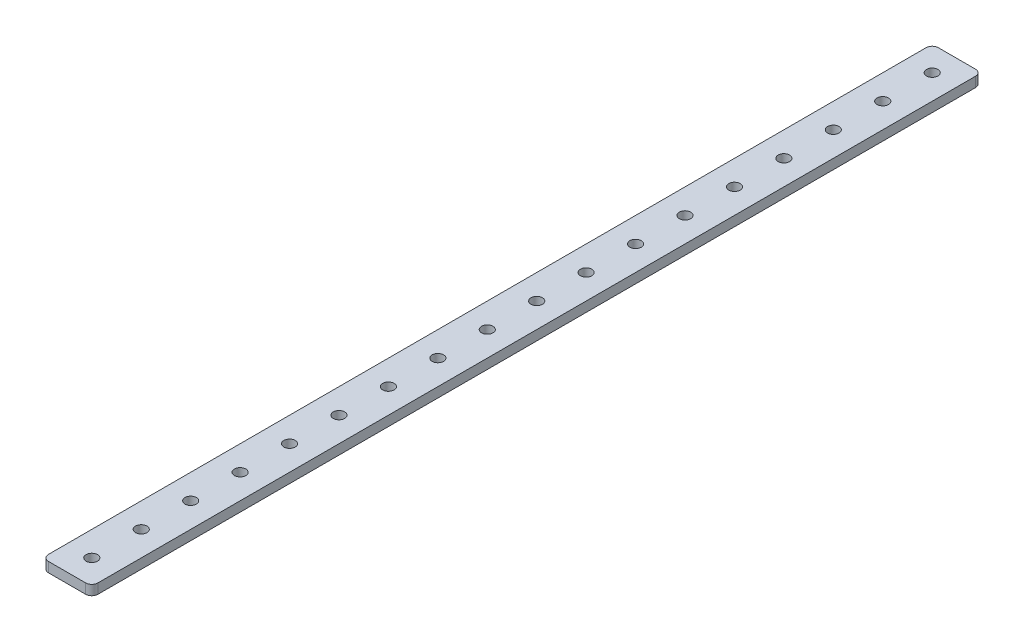
ISO-10303-21;
HEADER;
FILE_DESCRIPTION(('STEP AP214'),'2;1');
FILE_NAME('part.step','',(''),(''),'','','');
FILE_SCHEMA(('AUTOMOTIVE_DESIGN { 1 0 10303 214 1 1 1 1 }'));
ENDSEC;
DATA;
#1=APPLICATION_CONTEXT('core data for automotive mechanical design processes');
#2=APPLICATION_PROTOCOL_DEFINITION('international standard','automotive_design',2000,#1);
#3=PRODUCT_CONTEXT('',#1,'mechanical');
#4=PRODUCT('Part','Part','',(#3));
#5=PRODUCT_RELATED_PRODUCT_CATEGORY('part','',(#4));
#6=PRODUCT_DEFINITION_FORMATION('','',#4);
#7=PRODUCT_DEFINITION_CONTEXT('part definition',#1,'design');
#8=PRODUCT_DEFINITION('design','',#6,#7);
#9=PRODUCT_DEFINITION_SHAPE('','',#8);
#10=(LENGTH_UNIT() NAMED_UNIT(*) SI_UNIT(.MILLI.,.METRE.));
#11=(NAMED_UNIT(*) PLANE_ANGLE_UNIT() SI_UNIT($,.RADIAN.));
#12=(NAMED_UNIT(*) SI_UNIT($,.STERADIAN.) SOLID_ANGLE_UNIT());
#13=UNCERTAINTY_MEASURE_WITH_UNIT(LENGTH_MEASURE(1.E-05),#10,'distance_accuracy_value','');
#14=(GEOMETRIC_REPRESENTATION_CONTEXT(3) GLOBAL_UNCERTAINTY_ASSIGNED_CONTEXT((#13)) GLOBAL_UNIT_ASSIGNED_CONTEXT((#10,
#11,#12)) REPRESENTATION_CONTEXT('',''));
#15=CARTESIAN_POINT('',(0.,0.,0.));
#16=DIRECTION('',(0.,0.,1.));
#17=DIRECTION('',(1.,0.,0.));
#18=AXIS2_PLACEMENT_3D('',#15,#16,#17);
#19=CARTESIAN_POINT('',(6.,0.,-286.));
#20=DIRECTION('',(0.,1.,0.));
#21=DIRECTION('',(0.,0.,1.));
#22=AXIS2_PLACEMENT_3D('',#19,#20,#21);
#23=CYLINDRICAL_SURFACE('',#22,2.);
#24=CARTESIAN_POINT('',(6.,3.2,-286.));
#25=DIRECTION('',(0.,1.,0.));
#26=DIRECTION('',(0.,0.,1.));
#27=AXIS2_PLACEMENT_3D('',#24,#25,#26);
#28=CIRCLE('',#27,2.);
#29=CARTESIAN_POINT('',(8.,3.2,-286.));
#30=VERTEX_POINT('',#29);
#31=CARTESIAN_POINT('',(6.,3.2,-288.));
#32=VERTEX_POINT('',#31);
#33=EDGE_CURVE('E130',#30,#32,#28,.T.);
#34=ORIENTED_EDGE('',*,*,#33,.F.);
#35=DIRECTION('',(0.,1.,0.));
#36=VECTOR('',#35,1.);
#37=CARTESIAN_POINT('',(8.,0.,-286.));
#38=LINE('',#37,#36);
#39=CARTESIAN_POINT('',(8.,0.,-286.));
#40=VERTEX_POINT('',#39);
#41=EDGE_CURVE('E11',#40,#30,#38,.T.);
#42=ORIENTED_EDGE('',*,*,#41,.F.);
#43=CARTESIAN_POINT('',(6.,0.,-286.));
#44=DIRECTION('',(0.,1.,0.));
#45=DIRECTION('',(0.,0.,1.));
#46=AXIS2_PLACEMENT_3D('',#43,#44,#45);
#47=CIRCLE('',#46,2.);
#48=CARTESIAN_POINT('',(6.,0.,-288.));
#49=VERTEX_POINT('',#48);
#50=EDGE_CURVE('E151',#40,#49,#47,.T.);
#51=ORIENTED_EDGE('',*,*,#50,.T.);
#52=DIRECTION('',(0.,1.,0.));
#53=VECTOR('',#52,1.);
#54=CARTESIAN_POINT('',(6.,0.,-288.));
#55=LINE('',#54,#53);
#56=EDGE_CURVE('E36',#49,#32,#55,.T.);
#57=ORIENTED_EDGE('',*,*,#56,.T.);
#58=EDGE_LOOP('',(#34,#42,#51,#57));
#59=FACE_BOUND('',#58,.T.);
#60=ADVANCED_FACE('F33',(#59),#23,.T.);
#61=CARTESIAN_POINT('',(8.,0.,-2.));
#62=DIRECTION('',(1.,0.,0.));
#63=DIRECTION('',(0.,0.,-1.));
#64=AXIS2_PLACEMENT_3D('',#61,#62,#63);
#65=PLANE('',#64);
#66=DIRECTION('',(0.,0.,-1.));
#67=VECTOR('',#66,1.);
#68=CARTESIAN_POINT('',(8.,3.2,-2.));
#69=LINE('',#68,#67);
#70=CARTESIAN_POINT('',(8.,3.2,-2.));
#71=VERTEX_POINT('',#70);
#72=EDGE_CURVE('E149',#71,#30,#69,.T.);
#73=ORIENTED_EDGE('',*,*,#72,.F.);
#74=DIRECTION('',(0.,1.,0.));
#75=VECTOR('',#74,1.);
#76=CARTESIAN_POINT('',(8.,0.,-2.));
#77=LINE('',#76,#75);
#78=CARTESIAN_POINT('',(8.,0.,-2.));
#79=VERTEX_POINT('',#78);
#80=EDGE_CURVE('E42',#79,#71,#77,.T.);
#81=ORIENTED_EDGE('',*,*,#80,.F.);
#82=DIRECTION('',(0.,0.,-1.));
#83=VECTOR('',#82,1.);
#84=CARTESIAN_POINT('',(8.,0.,-2.));
#85=LINE('',#84,#83);
#86=EDGE_CURVE('E120',#79,#40,#85,.T.);
#87=ORIENTED_EDGE('',*,*,#86,.T.);
#88=ORIENTED_EDGE('',*,*,#41,.T.);
#89=EDGE_LOOP('',(#73,#81,#87,#88));
#90=FACE_BOUND('',#89,.T.);
#91=ADVANCED_FACE('F163',(#90),#65,.T.);
#92=CARTESIAN_POINT('',(6.,0.,-2.));
#93=DIRECTION('',(0.,1.,0.));
#94=DIRECTION('',(0.,0.,1.));
#95=AXIS2_PLACEMENT_3D('',#92,#93,#94);
#96=CYLINDRICAL_SURFACE('',#95,2.);
#97=CARTESIAN_POINT('',(6.,3.2,-2.));
#98=DIRECTION('',(0.,1.,0.));
#99=DIRECTION('',(0.,0.,1.));
#100=AXIS2_PLACEMENT_3D('',#97,#98,#99);
#101=CIRCLE('',#100,2.);
#102=CARTESIAN_POINT('',(6.,3.2,0.));
#103=VERTEX_POINT('',#102);
#104=EDGE_CURVE('E107',#103,#71,#101,.T.);
#105=ORIENTED_EDGE('',*,*,#104,.F.);
#106=DIRECTION('',(0.,1.,0.));
#107=VECTOR('',#106,1.);
#108=CARTESIAN_POINT('',(6.,0.,0.));
#109=LINE('',#108,#107);
#110=CARTESIAN_POINT('',(6.,0.,0.));
#111=VERTEX_POINT('',#110);
#112=EDGE_CURVE('E102',#111,#103,#109,.T.);
#113=ORIENTED_EDGE('',*,*,#112,.F.);
#114=CARTESIAN_POINT('',(6.,0.,-2.));
#115=DIRECTION('',(0.,1.,0.));
#116=DIRECTION('',(0.,0.,1.));
#117=AXIS2_PLACEMENT_3D('',#114,#115,#116);
#118=CIRCLE('',#117,2.);
#119=EDGE_CURVE('E105',#111,#79,#118,.T.);
#120=ORIENTED_EDGE('',*,*,#119,.T.);
#121=ORIENTED_EDGE('',*,*,#80,.T.);
#122=EDGE_LOOP('',(#105,#113,#120,#121));
#123=FACE_BOUND('',#122,.T.);
#124=ADVANCED_FACE('F104',(#123),#96,.T.);
#125=CARTESIAN_POINT('',(-6.,0.,0.));
#126=DIRECTION('',(0.,0.,1.));
#127=DIRECTION('',(1.,0.,0.));
#128=AXIS2_PLACEMENT_3D('',#125,#126,#127);
#129=PLANE('',#128);
#130=DIRECTION('',(1.,0.,0.));
#131=VECTOR('',#130,1.);
#132=CARTESIAN_POINT('',(-6.,3.2,0.));
#133=LINE('',#132,#131);
#134=CARTESIAN_POINT('',(-6.,3.2,0.));
#135=VERTEX_POINT('',#134);
#136=EDGE_CURVE('E146',#135,#103,#133,.T.);
#137=ORIENTED_EDGE('',*,*,#136,.F.);
#138=DIRECTION('',(0.,1.,0.));
#139=VECTOR('',#138,1.);
#140=CARTESIAN_POINT('',(-6.,0.,0.));
#141=LINE('',#140,#139);
#142=CARTESIAN_POINT('',(-6.,0.,0.));
#143=VERTEX_POINT('',#142);
#144=EDGE_CURVE('E112',#143,#135,#141,.T.);
#145=ORIENTED_EDGE('',*,*,#144,.F.);
#146=DIRECTION('',(1.,0.,0.));
#147=VECTOR('',#146,1.);
#148=CARTESIAN_POINT('',(-6.,0.,0.));
#149=LINE('',#148,#147);
#150=EDGE_CURVE('E118',#143,#111,#149,.T.);
#151=ORIENTED_EDGE('',*,*,#150,.T.);
#152=ORIENTED_EDGE('',*,*,#112,.T.);
#153=EDGE_LOOP('',(#137,#145,#151,#152));
#154=FACE_BOUND('',#153,.T.);
#155=ADVANCED_FACE('F122',(#154),#129,.T.);
#156=CARTESIAN_POINT('',(-6.,0.,-2.));
#157=DIRECTION('',(0.,1.,0.));
#158=DIRECTION('',(0.,0.,1.));
#159=AXIS2_PLACEMENT_3D('',#156,#157,#158);
#160=CYLINDRICAL_SURFACE('',#159,2.);
#161=CARTESIAN_POINT('',(-6.,3.2,-2.));
#162=DIRECTION('',(0.,1.,0.));
#163=DIRECTION('',(0.,0.,1.));
#164=AXIS2_PLACEMENT_3D('',#161,#162,#163);
#165=CIRCLE('',#164,2.);
#166=CARTESIAN_POINT('',(-8.,3.2,-2.));
#167=VERTEX_POINT('',#166);
#168=EDGE_CURVE('E143',#167,#135,#165,.T.);
#169=ORIENTED_EDGE('',*,*,#168,.F.);
#170=DIRECTION('',(0.,1.,0.));
#171=VECTOR('',#170,1.);
#172=CARTESIAN_POINT('',(-8.,0.,-2.));
#173=LINE('',#172,#171);
#174=CARTESIAN_POINT('',(-8.,0.,-2.));
#175=VERTEX_POINT('',#174);
#176=EDGE_CURVE('E155',#175,#167,#173,.T.);
#177=ORIENTED_EDGE('',*,*,#176,.F.);
#178=CARTESIAN_POINT('',(-6.,0.,-2.));
#179=DIRECTION('',(0.,1.,0.));
#180=DIRECTION('',(0.,0.,1.));
#181=AXIS2_PLACEMENT_3D('',#178,#179,#180);
#182=CIRCLE('',#181,2.);
#183=EDGE_CURVE('E123',#175,#143,#182,.T.);
#184=ORIENTED_EDGE('',*,*,#183,.T.);
#185=ORIENTED_EDGE('',*,*,#144,.T.);
#186=EDGE_LOOP('',(#169,#177,#184,#185));
#187=FACE_BOUND('',#186,.T.);
#188=ADVANCED_FACE('F176',(#187),#160,.T.);
#189=CARTESIAN_POINT('',(-8.,0.,-286.));
#190=DIRECTION('',(-1.,0.,0.));
#191=DIRECTION('',(0.,0.,1.));
#192=AXIS2_PLACEMENT_3D('',#189,#190,#191);
#193=PLANE('',#192);
#194=DIRECTION('',(0.,0.,1.));
#195=VECTOR('',#194,1.);
#196=CARTESIAN_POINT('',(-8.,3.2,-286.));
#197=LINE('',#196,#195);
#198=CARTESIAN_POINT('',(-8.,3.2,-286.));
#199=VERTEX_POINT('',#198);
#200=EDGE_CURVE('E140',#199,#167,#197,.T.);
#201=ORIENTED_EDGE('',*,*,#200,.F.);
#202=DIRECTION('',(0.,1.,0.));
#203=VECTOR('',#202,1.);
#204=CARTESIAN_POINT('',(-8.,0.,-286.));
#205=LINE('',#204,#203);
#206=CARTESIAN_POINT('',(-8.,0.,-286.));
#207=VERTEX_POINT('',#206);
#208=EDGE_CURVE('E157',#207,#199,#205,.T.);
#209=ORIENTED_EDGE('',*,*,#208,.F.);
#210=DIRECTION('',(0.,0.,1.));
#211=VECTOR('',#210,1.);
#212=CARTESIAN_POINT('',(-8.,0.,-286.));
#213=LINE('',#212,#211);
#214=EDGE_CURVE('E125',#207,#175,#213,.T.);
#215=ORIENTED_EDGE('',*,*,#214,.T.);
#216=ORIENTED_EDGE('',*,*,#176,.T.);
#217=EDGE_LOOP('',(#201,#209,#215,#216));
#218=FACE_BOUND('',#217,.T.);
#219=ADVANCED_FACE('F179',(#218),#193,.T.);
#220=CARTESIAN_POINT('',(-6.,0.,-286.));
#221=DIRECTION('',(0.,1.,0.));
#222=DIRECTION('',(0.,0.,1.));
#223=AXIS2_PLACEMENT_3D('',#220,#221,#222);
#224=CYLINDRICAL_SURFACE('',#223,2.);
#225=CARTESIAN_POINT('',(-6.,3.2,-286.));
#226=DIRECTION('',(0.,1.,0.));
#227=DIRECTION('',(0.,0.,1.));
#228=AXIS2_PLACEMENT_3D('',#225,#226,#227);
#229=CIRCLE('',#228,2.);
#230=CARTESIAN_POINT('',(-6.,3.2,-288.));
#231=VERTEX_POINT('',#230);
#232=EDGE_CURVE('E137',#231,#199,#229,.T.);
#233=ORIENTED_EDGE('',*,*,#232,.F.);
#234=DIRECTION('',(0.,1.,0.));
#235=VECTOR('',#234,1.);
#236=CARTESIAN_POINT('',(-6.,0.,-288.));
#237=LINE('',#236,#235);
#238=CARTESIAN_POINT('',(-6.,0.,-288.));
#239=VERTEX_POINT('',#238);
#240=EDGE_CURVE('E158',#239,#231,#237,.T.);
#241=ORIENTED_EDGE('',*,*,#240,.F.);
#242=CARTESIAN_POINT('',(-6.,0.,-286.));
#243=DIRECTION('',(0.,1.,0.));
#244=DIRECTION('',(0.,0.,1.));
#245=AXIS2_PLACEMENT_3D('',#242,#243,#244);
#246=CIRCLE('',#245,2.);
#247=EDGE_CURVE('E385',#239,#207,#246,.T.);
#248=ORIENTED_EDGE('',*,*,#247,.T.);
#249=ORIENTED_EDGE('',*,*,#208,.T.);
#250=EDGE_LOOP('',(#233,#241,#248,#249));
#251=FACE_BOUND('',#250,.T.);
#252=ADVANCED_FACE('F183',(#251),#224,.T.);
#253=CARTESIAN_POINT('',(6.,0.,-288.));
#254=DIRECTION('',(0.,0.,-1.));
#255=DIRECTION('',(-1.,0.,0.));
#256=AXIS2_PLACEMENT_3D('',#253,#254,#255);
#257=PLANE('',#256);
#258=DIRECTION('',(-1.,0.,0.));
#259=VECTOR('',#258,1.);
#260=CARTESIAN_POINT('',(6.,3.2,-288.));
#261=LINE('',#260,#259);
#262=EDGE_CURVE('E133',#32,#231,#261,.T.);
#263=ORIENTED_EDGE('',*,*,#262,.F.);
#264=ORIENTED_EDGE('',*,*,#56,.F.);
#265=DIRECTION('',(-1.,0.,0.));
#266=VECTOR('',#265,1.);
#267=CARTESIAN_POINT('',(6.,0.,-288.));
#268=LINE('',#267,#266);
#269=EDGE_CURVE('E383',#49,#239,#268,.T.);
#270=ORIENTED_EDGE('',*,*,#269,.T.);
#271=ORIENTED_EDGE('',*,*,#240,.T.);
#272=EDGE_LOOP('',(#263,#264,#270,#271));
#273=FACE_BOUND('',#272,.T.);
#274=ADVANCED_FACE('F160',(#273),#257,.T.);
#275=CARTESIAN_POINT('',(6.,0.,-286.));
#276=DIRECTION('',(0.,1.,0.));
#277=DIRECTION('',(0.,0.,1.));
#278=AXIS2_PLACEMENT_3D('',#275,#276,#277);
#279=PLANE('',#278);
#280=CARTESIAN_POINT('',(0.,0.,-24.));
#281=DIRECTION('',(0.,1.,0.));
#282=DIRECTION('',(0.,0.,-1.));
#283=AXIS2_PLACEMENT_3D('',#280,#281,#282);
#284=CIRCLE('',#283,1.85);
#285=CARTESIAN_POINT('',(0.,0.,-25.85));
#286=VERTEX_POINT('',#285);
#287=EDGE_CURVE('E274',#286,#286,#284,.T.);
#288=ORIENTED_EDGE('',*,*,#287,.T.);
#289=EDGE_LOOP('',(#288));
#290=FACE_BOUND('',#289,.T.);
#291=CARTESIAN_POINT('',(0.,0.,-40.));
#292=DIRECTION('',(0.,1.,0.));
#293=DIRECTION('',(0.,0.,-1.));
#294=AXIS2_PLACEMENT_3D('',#291,#292,#293);
#295=CIRCLE('',#294,1.85);
#296=CARTESIAN_POINT('',(0.,0.,-41.85));
#297=VERTEX_POINT('',#296);
#298=EDGE_CURVE('E282',#297,#297,#295,.T.);
#299=ORIENTED_EDGE('',*,*,#298,.T.);
#300=EDGE_LOOP('',(#299));
#301=FACE_BOUND('',#300,.T.);
#302=CARTESIAN_POINT('',(0.,0.,-56.));
#303=DIRECTION('',(0.,1.,0.));
#304=DIRECTION('',(0.,0.,-1.));
#305=AXIS2_PLACEMENT_3D('',#302,#303,#304);
#306=CIRCLE('',#305,1.85);
#307=CARTESIAN_POINT('',(0.,0.,-57.85));
#308=VERTEX_POINT('',#307);
#309=EDGE_CURVE('E288',#308,#308,#306,.T.);
#310=ORIENTED_EDGE('',*,*,#309,.T.);
#311=EDGE_LOOP('',(#310));
#312=FACE_BOUND('',#311,.T.);
#313=CARTESIAN_POINT('',(0.,0.,-72.));
#314=DIRECTION('',(0.,1.,0.));
#315=DIRECTION('',(0.,0.,-1.));
#316=AXIS2_PLACEMENT_3D('',#313,#314,#315);
#317=CIRCLE('',#316,1.85);
#318=CARTESIAN_POINT('',(0.,0.,-73.85));
#319=VERTEX_POINT('',#318);
#320=EDGE_CURVE('E294',#319,#319,#317,.T.);
#321=ORIENTED_EDGE('',*,*,#320,.T.);
#322=EDGE_LOOP('',(#321));
#323=FACE_BOUND('',#322,.T.);
#324=CARTESIAN_POINT('',(0.,0.,-88.));
#325=DIRECTION('',(0.,1.,0.));
#326=DIRECTION('',(0.,0.,-1.));
#327=AXIS2_PLACEMENT_3D('',#324,#325,#326);
#328=CIRCLE('',#327,1.85);
#329=CARTESIAN_POINT('',(0.,0.,-89.85));
#330=VERTEX_POINT('',#329);
#331=EDGE_CURVE('E300',#330,#330,#328,.T.);
#332=ORIENTED_EDGE('',*,*,#331,.T.);
#333=EDGE_LOOP('',(#332));
#334=FACE_BOUND('',#333,.T.);
#335=CARTESIAN_POINT('',(0.,0.,-104.));
#336=DIRECTION('',(0.,1.,0.));
#337=DIRECTION('',(0.,0.,-1.));
#338=AXIS2_PLACEMENT_3D('',#335,#336,#337);
#339=CIRCLE('',#338,1.85);
#340=CARTESIAN_POINT('',(0.,0.,-105.85));
#341=VERTEX_POINT('',#340);
#342=EDGE_CURVE('E306',#341,#341,#339,.T.);
#343=ORIENTED_EDGE('',*,*,#342,.T.);
#344=EDGE_LOOP('',(#343));
#345=FACE_BOUND('',#344,.T.);
#346=CARTESIAN_POINT('',(0.,0.,-120.));
#347=DIRECTION('',(0.,1.,0.));
#348=DIRECTION('',(0.,0.,-1.));
#349=AXIS2_PLACEMENT_3D('',#346,#347,#348);
#350=CIRCLE('',#349,1.85);
#351=CARTESIAN_POINT('',(0.,0.,-121.85));
#352=VERTEX_POINT('',#351);
#353=EDGE_CURVE('E312',#352,#352,#350,.T.);
#354=ORIENTED_EDGE('',*,*,#353,.T.);
#355=EDGE_LOOP('',(#354));
#356=FACE_BOUND('',#355,.T.);
#357=CARTESIAN_POINT('',(0.,0.,-136.));
#358=DIRECTION('',(0.,1.,0.));
#359=DIRECTION('',(0.,0.,-1.));
#360=AXIS2_PLACEMENT_3D('',#357,#358,#359);
#361=CIRCLE('',#360,1.84999999999999);
#362=CARTESIAN_POINT('',(0.,0.,-137.85));
#363=VERTEX_POINT('',#362);
#364=EDGE_CURVE('E318',#363,#363,#361,.T.);
#365=ORIENTED_EDGE('',*,*,#364,.T.);
#366=EDGE_LOOP('',(#365));
#367=FACE_BOUND('',#366,.T.);
#368=CARTESIAN_POINT('',(0.,0.,-152.));
#369=DIRECTION('',(0.,1.,0.));
#370=DIRECTION('',(0.,0.,-1.));
#371=AXIS2_PLACEMENT_3D('',#368,#369,#370);
#372=CIRCLE('',#371,1.84999999999999);
#373=CARTESIAN_POINT('',(0.,0.,-153.85));
#374=VERTEX_POINT('',#373);
#375=EDGE_CURVE('E324',#374,#374,#372,.T.);
#376=ORIENTED_EDGE('',*,*,#375,.T.);
#377=EDGE_LOOP('',(#376));
#378=FACE_BOUND('',#377,.T.);
#379=CARTESIAN_POINT('',(0.,0.,-168.));
#380=DIRECTION('',(0.,1.,0.));
#381=DIRECTION('',(0.,0.,-1.));
#382=AXIS2_PLACEMENT_3D('',#379,#380,#381);
#383=CIRCLE('',#382,1.84999999999999);
#384=CARTESIAN_POINT('',(0.,0.,-169.85));
#385=VERTEX_POINT('',#384);
#386=EDGE_CURVE('E330',#385,#385,#383,.T.);
#387=ORIENTED_EDGE('',*,*,#386,.T.);
#388=EDGE_LOOP('',(#387));
#389=FACE_BOUND('',#388,.T.);
#390=CARTESIAN_POINT('',(0.,0.,-184.));
#391=DIRECTION('',(0.,1.,0.));
#392=DIRECTION('',(0.,0.,-1.));
#393=AXIS2_PLACEMENT_3D('',#390,#391,#392);
#394=CIRCLE('',#393,1.84999999999999);
#395=CARTESIAN_POINT('',(0.,0.,-185.85));
#396=VERTEX_POINT('',#395);
#397=EDGE_CURVE('E336',#396,#396,#394,.T.);
#398=ORIENTED_EDGE('',*,*,#397,.T.);
#399=EDGE_LOOP('',(#398));
#400=FACE_BOUND('',#399,.T.);
#401=CARTESIAN_POINT('',(0.,0.,-200.));
#402=DIRECTION('',(0.,1.,0.));
#403=DIRECTION('',(0.,0.,-1.));
#404=AXIS2_PLACEMENT_3D('',#401,#402,#403);
#405=CIRCLE('',#404,1.84999999999999);
#406=CARTESIAN_POINT('',(0.,0.,-201.85));
#407=VERTEX_POINT('',#406);
#408=EDGE_CURVE('E342',#407,#407,#405,.T.);
#409=ORIENTED_EDGE('',*,*,#408,.T.);
#410=EDGE_LOOP('',(#409));
#411=FACE_BOUND('',#410,.T.);
#412=CARTESIAN_POINT('',(0.,0.,-216.));
#413=DIRECTION('',(0.,1.,0.));
#414=DIRECTION('',(0.,0.,-1.));
#415=AXIS2_PLACEMENT_3D('',#412,#413,#414);
#416=CIRCLE('',#415,1.84999999999999);
#417=CARTESIAN_POINT('',(0.,0.,-217.85));
#418=VERTEX_POINT('',#417);
#419=EDGE_CURVE('E348',#418,#418,#416,.T.);
#420=ORIENTED_EDGE('',*,*,#419,.T.);
#421=EDGE_LOOP('',(#420));
#422=FACE_BOUND('',#421,.T.);
#423=CARTESIAN_POINT('',(0.,0.,-232.));
#424=DIRECTION('',(0.,1.,0.));
#425=DIRECTION('',(0.,0.,-1.));
#426=AXIS2_PLACEMENT_3D('',#423,#424,#425);
#427=CIRCLE('',#426,1.84999999999999);
#428=CARTESIAN_POINT('',(0.,0.,-233.85));
#429=VERTEX_POINT('',#428);
#430=EDGE_CURVE('E354',#429,#429,#427,.T.);
#431=ORIENTED_EDGE('',*,*,#430,.T.);
#432=EDGE_LOOP('',(#431));
#433=FACE_BOUND('',#432,.T.);
#434=CARTESIAN_POINT('',(0.,0.,-248.));
#435=DIRECTION('',(0.,1.,0.));
#436=DIRECTION('',(0.,0.,-1.));
#437=AXIS2_PLACEMENT_3D('',#434,#435,#436);
#438=CIRCLE('',#437,1.84999999999999);
#439=CARTESIAN_POINT('',(0.,0.,-249.85));
#440=VERTEX_POINT('',#439);
#441=EDGE_CURVE('E360',#440,#440,#438,.T.);
#442=ORIENTED_EDGE('',*,*,#441,.T.);
#443=EDGE_LOOP('',(#442));
#444=FACE_BOUND('',#443,.T.);
#445=CARTESIAN_POINT('',(0.,0.,-264.));
#446=DIRECTION('',(0.,1.,0.));
#447=DIRECTION('',(0.,0.,-1.));
#448=AXIS2_PLACEMENT_3D('',#445,#446,#447);
#449=CIRCLE('',#448,1.85000000000002);
#450=CARTESIAN_POINT('',(0.,0.,-265.85));
#451=VERTEX_POINT('',#450);
#452=EDGE_CURVE('E366',#451,#451,#449,.T.);
#453=ORIENTED_EDGE('',*,*,#452,.T.);
#454=EDGE_LOOP('',(#453));
#455=FACE_BOUND('',#454,.T.);
#456=CARTESIAN_POINT('',(0.,0.,-280.));
#457=DIRECTION('',(0.,1.,0.));
#458=DIRECTION('',(0.,0.,-1.));
#459=AXIS2_PLACEMENT_3D('',#456,#457,#458);
#460=CIRCLE('',#459,1.85000000000002);
#461=CARTESIAN_POINT('',(0.,0.,-281.85));
#462=VERTEX_POINT('',#461);
#463=EDGE_CURVE('E372',#462,#462,#460,.T.);
#464=ORIENTED_EDGE('',*,*,#463,.T.);
#465=EDGE_LOOP('',(#464));
#466=FACE_BOUND('',#465,.T.);
#467=CARTESIAN_POINT('',(0.,0.,-8.));
#468=DIRECTION('',(0.,1.,0.));
#469=DIRECTION('',(0.,0.,-1.));
#470=AXIS2_PLACEMENT_3D('',#467,#468,#469);
#471=CIRCLE('',#470,1.85);
#472=CARTESIAN_POINT('',(0.,0.,-9.85));
#473=VERTEX_POINT('',#472);
#474=EDGE_CURVE('E134',#473,#473,#471,.T.);
#475=ORIENTED_EDGE('',*,*,#474,.T.);
#476=EDGE_LOOP('',(#475));
#477=FACE_BOUND('',#476,.T.);
#478=ORIENTED_EDGE('',*,*,#50,.F.);
#479=ORIENTED_EDGE('',*,*,#86,.F.);
#480=ORIENTED_EDGE('',*,*,#119,.F.);
#481=ORIENTED_EDGE('',*,*,#150,.F.);
#482=ORIENTED_EDGE('',*,*,#183,.F.);
#483=ORIENTED_EDGE('',*,*,#214,.F.);
#484=ORIENTED_EDGE('',*,*,#247,.F.);
#485=ORIENTED_EDGE('',*,*,#269,.F.);
#486=EDGE_LOOP('',(#478,#479,#480,#481,#482,#483,#484,#485));
#487=FACE_BOUND('',#486,.T.);
#488=ADVANCED_FACE('F116',(#290,#301,#312,#323,#334,#345,#356,#367,#378,#389,#400,#411,#422,
#433,#444,#455,#466,#477,#487),#279,.F.);
#489=CARTESIAN_POINT('',(6.,3.2,-286.));
#490=DIRECTION('',(0.,1.,0.));
#491=DIRECTION('',(0.,0.,1.));
#492=AXIS2_PLACEMENT_3D('',#489,#490,#491);
#493=PLANE('',#492);
#494=CARTESIAN_POINT('',(0.,3.2,-24.));
#495=DIRECTION('',(0.,1.,0.));
#496=DIRECTION('',(0.,0.,-1.));
#497=AXIS2_PLACEMENT_3D('',#494,#495,#496);
#498=CIRCLE('',#497,1.85);
#499=CARTESIAN_POINT('',(0.,3.2,-25.85));
#500=VERTEX_POINT('',#499);
#501=EDGE_CURVE('E277',#500,#500,#498,.T.);
#502=ORIENTED_EDGE('',*,*,#501,.F.);
#503=EDGE_LOOP('',(#502));
#504=FACE_BOUND('',#503,.T.);
#505=CARTESIAN_POINT('',(0.,3.2,-40.));
#506=DIRECTION('',(0.,1.,0.));
#507=DIRECTION('',(0.,0.,-1.));
#508=AXIS2_PLACEMENT_3D('',#505,#506,#507);
#509=CIRCLE('',#508,1.85);
#510=CARTESIAN_POINT('',(0.,3.2,-41.85));
#511=VERTEX_POINT('',#510);
#512=EDGE_CURVE('E279',#511,#511,#509,.T.);
#513=ORIENTED_EDGE('',*,*,#512,.F.);
#514=EDGE_LOOP('',(#513));
#515=FACE_BOUND('',#514,.T.);
#516=CARTESIAN_POINT('',(0.,3.2,-56.));
#517=DIRECTION('',(0.,1.,0.));
#518=DIRECTION('',(0.,0.,-1.));
#519=AXIS2_PLACEMENT_3D('',#516,#517,#518);
#520=CIRCLE('',#519,1.85);
#521=CARTESIAN_POINT('',(0.,3.2,-57.85));
#522=VERTEX_POINT('',#521);
#523=EDGE_CURVE('E285',#522,#522,#520,.T.);
#524=ORIENTED_EDGE('',*,*,#523,.F.);
#525=EDGE_LOOP('',(#524));
#526=FACE_BOUND('',#525,.T.);
#527=CARTESIAN_POINT('',(0.,3.2,-72.));
#528=DIRECTION('',(0.,1.,0.));
#529=DIRECTION('',(0.,0.,-1.));
#530=AXIS2_PLACEMENT_3D('',#527,#528,#529);
#531=CIRCLE('',#530,1.85);
#532=CARTESIAN_POINT('',(0.,3.2,-73.85));
#533=VERTEX_POINT('',#532);
#534=EDGE_CURVE('E291',#533,#533,#531,.T.);
#535=ORIENTED_EDGE('',*,*,#534,.F.);
#536=EDGE_LOOP('',(#535));
#537=FACE_BOUND('',#536,.T.);
#538=CARTESIAN_POINT('',(0.,3.2,-88.));
#539=DIRECTION('',(0.,1.,0.));
#540=DIRECTION('',(0.,0.,-1.));
#541=AXIS2_PLACEMENT_3D('',#538,#539,#540);
#542=CIRCLE('',#541,1.85);
#543=CARTESIAN_POINT('',(0.,3.2,-89.85));
#544=VERTEX_POINT('',#543);
#545=EDGE_CURVE('E297',#544,#544,#542,.T.);
#546=ORIENTED_EDGE('',*,*,#545,.F.);
#547=EDGE_LOOP('',(#546));
#548=FACE_BOUND('',#547,.T.);
#549=CARTESIAN_POINT('',(0.,3.2,-104.));
#550=DIRECTION('',(0.,1.,0.));
#551=DIRECTION('',(0.,0.,-1.));
#552=AXIS2_PLACEMENT_3D('',#549,#550,#551);
#553=CIRCLE('',#552,1.85);
#554=CARTESIAN_POINT('',(0.,3.2,-105.85));
#555=VERTEX_POINT('',#554);
#556=EDGE_CURVE('E303',#555,#555,#553,.T.);
#557=ORIENTED_EDGE('',*,*,#556,.F.);
#558=EDGE_LOOP('',(#557));
#559=FACE_BOUND('',#558,.T.);
#560=CARTESIAN_POINT('',(0.,3.2,-120.));
#561=DIRECTION('',(0.,1.,0.));
#562=DIRECTION('',(0.,0.,-1.));
#563=AXIS2_PLACEMENT_3D('',#560,#561,#562);
#564=CIRCLE('',#563,1.85);
#565=CARTESIAN_POINT('',(0.,3.2,-121.85));
#566=VERTEX_POINT('',#565);
#567=EDGE_CURVE('E309',#566,#566,#564,.T.);
#568=ORIENTED_EDGE('',*,*,#567,.F.);
#569=EDGE_LOOP('',(#568));
#570=FACE_BOUND('',#569,.T.);
#571=CARTESIAN_POINT('',(0.,3.2,-136.));
#572=DIRECTION('',(0.,1.,0.));
#573=DIRECTION('',(0.,0.,-1.));
#574=AXIS2_PLACEMENT_3D('',#571,#572,#573);
#575=CIRCLE('',#574,1.84999999999999);
#576=CARTESIAN_POINT('',(0.,3.2,-137.85));
#577=VERTEX_POINT('',#576);
#578=EDGE_CURVE('E315',#577,#577,#575,.T.);
#579=ORIENTED_EDGE('',*,*,#578,.F.);
#580=EDGE_LOOP('',(#579));
#581=FACE_BOUND('',#580,.T.);
#582=CARTESIAN_POINT('',(0.,3.2,-152.));
#583=DIRECTION('',(0.,1.,0.));
#584=DIRECTION('',(0.,0.,-1.));
#585=AXIS2_PLACEMENT_3D('',#582,#583,#584);
#586=CIRCLE('',#585,1.84999999999999);
#587=CARTESIAN_POINT('',(0.,3.2,-153.85));
#588=VERTEX_POINT('',#587);
#589=EDGE_CURVE('E321',#588,#588,#586,.T.);
#590=ORIENTED_EDGE('',*,*,#589,.F.);
#591=EDGE_LOOP('',(#590));
#592=FACE_BOUND('',#591,.T.);
#593=CARTESIAN_POINT('',(0.,3.2,-168.));
#594=DIRECTION('',(0.,1.,0.));
#595=DIRECTION('',(0.,0.,-1.));
#596=AXIS2_PLACEMENT_3D('',#593,#594,#595);
#597=CIRCLE('',#596,1.84999999999999);
#598=CARTESIAN_POINT('',(0.,3.2,-169.85));
#599=VERTEX_POINT('',#598);
#600=EDGE_CURVE('E327',#599,#599,#597,.T.);
#601=ORIENTED_EDGE('',*,*,#600,.F.);
#602=EDGE_LOOP('',(#601));
#603=FACE_BOUND('',#602,.T.);
#604=CARTESIAN_POINT('',(0.,3.2,-184.));
#605=DIRECTION('',(0.,1.,0.));
#606=DIRECTION('',(0.,0.,-1.));
#607=AXIS2_PLACEMENT_3D('',#604,#605,#606);
#608=CIRCLE('',#607,1.84999999999999);
#609=CARTESIAN_POINT('',(0.,3.2,-185.85));
#610=VERTEX_POINT('',#609);
#611=EDGE_CURVE('E333',#610,#610,#608,.T.);
#612=ORIENTED_EDGE('',*,*,#611,.F.);
#613=EDGE_LOOP('',(#612));
#614=FACE_BOUND('',#613,.T.);
#615=CARTESIAN_POINT('',(0.,3.2,-200.));
#616=DIRECTION('',(0.,1.,0.));
#617=DIRECTION('',(0.,0.,-1.));
#618=AXIS2_PLACEMENT_3D('',#615,#616,#617);
#619=CIRCLE('',#618,1.84999999999999);
#620=CARTESIAN_POINT('',(0.,3.2,-201.85));
#621=VERTEX_POINT('',#620);
#622=EDGE_CURVE('E339',#621,#621,#619,.T.);
#623=ORIENTED_EDGE('',*,*,#622,.F.);
#624=EDGE_LOOP('',(#623));
#625=FACE_BOUND('',#624,.T.);
#626=CARTESIAN_POINT('',(0.,3.2,-216.));
#627=DIRECTION('',(0.,1.,0.));
#628=DIRECTION('',(0.,0.,-1.));
#629=AXIS2_PLACEMENT_3D('',#626,#627,#628);
#630=CIRCLE('',#629,1.84999999999999);
#631=CARTESIAN_POINT('',(0.,3.2,-217.85));
#632=VERTEX_POINT('',#631);
#633=EDGE_CURVE('E345',#632,#632,#630,.T.);
#634=ORIENTED_EDGE('',*,*,#633,.F.);
#635=EDGE_LOOP('',(#634));
#636=FACE_BOUND('',#635,.T.);
#637=CARTESIAN_POINT('',(0.,3.2,-232.));
#638=DIRECTION('',(0.,1.,0.));
#639=DIRECTION('',(0.,0.,-1.));
#640=AXIS2_PLACEMENT_3D('',#637,#638,#639);
#641=CIRCLE('',#640,1.84999999999999);
#642=CARTESIAN_POINT('',(0.,3.2,-233.85));
#643=VERTEX_POINT('',#642);
#644=EDGE_CURVE('E351',#643,#643,#641,.T.);
#645=ORIENTED_EDGE('',*,*,#644,.F.);
#646=EDGE_LOOP('',(#645));
#647=FACE_BOUND('',#646,.T.);
#648=CARTESIAN_POINT('',(0.,3.2,-248.));
#649=DIRECTION('',(0.,1.,0.));
#650=DIRECTION('',(0.,0.,-1.));
#651=AXIS2_PLACEMENT_3D('',#648,#649,#650);
#652=CIRCLE('',#651,1.84999999999999);
#653=CARTESIAN_POINT('',(0.,3.2,-249.85));
#654=VERTEX_POINT('',#653);
#655=EDGE_CURVE('E357',#654,#654,#652,.T.);
#656=ORIENTED_EDGE('',*,*,#655,.F.);
#657=EDGE_LOOP('',(#656));
#658=FACE_BOUND('',#657,.T.);
#659=CARTESIAN_POINT('',(0.,3.2,-264.));
#660=DIRECTION('',(0.,1.,0.));
#661=DIRECTION('',(0.,0.,-1.));
#662=AXIS2_PLACEMENT_3D('',#659,#660,#661);
#663=CIRCLE('',#662,1.85000000000002);
#664=CARTESIAN_POINT('',(0.,3.2,-265.85));
#665=VERTEX_POINT('',#664);
#666=EDGE_CURVE('E363',#665,#665,#663,.T.);
#667=ORIENTED_EDGE('',*,*,#666,.F.);
#668=EDGE_LOOP('',(#667));
#669=FACE_BOUND('',#668,.T.);
#670=CARTESIAN_POINT('',(0.,3.2,-280.));
#671=DIRECTION('',(0.,1.,0.));
#672=DIRECTION('',(0.,0.,-1.));
#673=AXIS2_PLACEMENT_3D('',#670,#671,#672);
#674=CIRCLE('',#673,1.85000000000002);
#675=CARTESIAN_POINT('',(0.,3.2,-281.85));
#676=VERTEX_POINT('',#675);
#677=EDGE_CURVE('E369',#676,#676,#674,.T.);
#678=ORIENTED_EDGE('',*,*,#677,.F.);
#679=EDGE_LOOP('',(#678));
#680=FACE_BOUND('',#679,.T.);
#681=CARTESIAN_POINT('',(0.,3.2,-8.));
#682=DIRECTION('',(0.,1.,0.));
#683=DIRECTION('',(0.,0.,-1.));
#684=AXIS2_PLACEMENT_3D('',#681,#682,#683);
#685=CIRCLE('',#684,1.85);
#686=CARTESIAN_POINT('',(0.,3.2,-9.85));
#687=VERTEX_POINT('',#686);
#688=EDGE_CURVE('E375',#687,#687,#685,.T.);
#689=ORIENTED_EDGE('',*,*,#688,.F.);
#690=EDGE_LOOP('',(#689));
#691=FACE_BOUND('',#690,.T.);
#692=ORIENTED_EDGE('',*,*,#33,.T.);
#693=ORIENTED_EDGE('',*,*,#262,.T.);
#694=ORIENTED_EDGE('',*,*,#232,.T.);
#695=ORIENTED_EDGE('',*,*,#200,.T.);
#696=ORIENTED_EDGE('',*,*,#168,.T.);
#697=ORIENTED_EDGE('',*,*,#136,.T.);
#698=ORIENTED_EDGE('',*,*,#104,.T.);
#699=ORIENTED_EDGE('',*,*,#72,.T.);
#700=EDGE_LOOP('',(#692,#693,#694,#695,#696,#697,#698,#699));
#701=FACE_BOUND('',#700,.T.);
#702=ADVANCED_FACE('F162',(#504,#515,#526,#537,#548,#559,#570,#581,#592,#603,#614,#625,#636,
#647,#658,#669,#680,#691,#701),#493,.T.);
#703=CARTESIAN_POINT('',(0.,0.,-8.));
#704=DIRECTION('',(0.,1.,0.));
#705=DIRECTION('',(0.,0.,1.));
#706=AXIS2_PLACEMENT_3D('',#703,#704,#705);
#707=CYLINDRICAL_SURFACE('',#706,1.85);
#708=ORIENTED_EDGE('',*,*,#474,.F.);
#709=EDGE_LOOP('',(#708));
#710=FACE_BOUND('',#709,.T.);
#711=ORIENTED_EDGE('',*,*,#688,.T.);
#712=EDGE_LOOP('',(#711));
#713=FACE_BOUND('',#712,.T.);
#714=ADVANCED_FACE('F195',(#710,#713),#707,.F.);
#715=CARTESIAN_POINT('',(0.,0.,-280.));
#716=DIRECTION('',(0.,1.,0.));
#717=DIRECTION('',(0.,0.,1.));
#718=AXIS2_PLACEMENT_3D('',#715,#716,#717);
#719=CYLINDRICAL_SURFACE('',#718,1.85000000000002);
#720=ORIENTED_EDGE('',*,*,#463,.F.);
#721=EDGE_LOOP('',(#720));
#722=FACE_BOUND('',#721,.T.);
#723=ORIENTED_EDGE('',*,*,#677,.T.);
#724=EDGE_LOOP('',(#723));
#725=FACE_BOUND('',#724,.T.);
#726=ADVANCED_FACE('F202',(#722,#725),#719,.F.);
#727=CARTESIAN_POINT('',(0.,0.,-264.));
#728=DIRECTION('',(0.,1.,0.));
#729=DIRECTION('',(0.,0.,1.));
#730=AXIS2_PLACEMENT_3D('',#727,#728,#729);
#731=CYLINDRICAL_SURFACE('',#730,1.85000000000002);
#732=ORIENTED_EDGE('',*,*,#452,.F.);
#733=EDGE_LOOP('',(#732));
#734=FACE_BOUND('',#733,.T.);
#735=ORIENTED_EDGE('',*,*,#666,.T.);
#736=EDGE_LOOP('',(#735));
#737=FACE_BOUND('',#736,.T.);
#738=ADVANCED_FACE('F206',(#734,#737),#731,.F.);
#739=CARTESIAN_POINT('',(0.,0.,-248.));
#740=DIRECTION('',(0.,1.,0.));
#741=DIRECTION('',(0.,0.,1.));
#742=AXIS2_PLACEMENT_3D('',#739,#740,#741);
#743=CYLINDRICAL_SURFACE('',#742,1.84999999999999);
#744=ORIENTED_EDGE('',*,*,#441,.F.);
#745=EDGE_LOOP('',(#744));
#746=FACE_BOUND('',#745,.T.);
#747=ORIENTED_EDGE('',*,*,#655,.T.);
#748=EDGE_LOOP('',(#747));
#749=FACE_BOUND('',#748,.T.);
#750=ADVANCED_FACE('F210',(#746,#749),#743,.F.);
#751=CARTESIAN_POINT('',(0.,0.,-232.));
#752=DIRECTION('',(0.,1.,0.));
#753=DIRECTION('',(0.,0.,1.));
#754=AXIS2_PLACEMENT_3D('',#751,#752,#753);
#755=CYLINDRICAL_SURFACE('',#754,1.84999999999999);
#756=ORIENTED_EDGE('',*,*,#430,.F.);
#757=EDGE_LOOP('',(#756));
#758=FACE_BOUND('',#757,.T.);
#759=ORIENTED_EDGE('',*,*,#644,.T.);
#760=EDGE_LOOP('',(#759));
#761=FACE_BOUND('',#760,.T.);
#762=ADVANCED_FACE('F214',(#758,#761),#755,.F.);
#763=CARTESIAN_POINT('',(0.,0.,-216.));
#764=DIRECTION('',(0.,1.,0.));
#765=DIRECTION('',(0.,0.,1.));
#766=AXIS2_PLACEMENT_3D('',#763,#764,#765);
#767=CYLINDRICAL_SURFACE('',#766,1.84999999999999);
#768=ORIENTED_EDGE('',*,*,#419,.F.);
#769=EDGE_LOOP('',(#768));
#770=FACE_BOUND('',#769,.T.);
#771=ORIENTED_EDGE('',*,*,#633,.T.);
#772=EDGE_LOOP('',(#771));
#773=FACE_BOUND('',#772,.T.);
#774=ADVANCED_FACE('F218',(#770,#773),#767,.F.);
#775=CARTESIAN_POINT('',(0.,0.,-200.));
#776=DIRECTION('',(0.,1.,0.));
#777=DIRECTION('',(0.,0.,1.));
#778=AXIS2_PLACEMENT_3D('',#775,#776,#777);
#779=CYLINDRICAL_SURFACE('',#778,1.84999999999999);
#780=ORIENTED_EDGE('',*,*,#408,.F.);
#781=EDGE_LOOP('',(#780));
#782=FACE_BOUND('',#781,.T.);
#783=ORIENTED_EDGE('',*,*,#622,.T.);
#784=EDGE_LOOP('',(#783));
#785=FACE_BOUND('',#784,.T.);
#786=ADVANCED_FACE('F222',(#782,#785),#779,.F.);
#787=CARTESIAN_POINT('',(0.,0.,-184.));
#788=DIRECTION('',(0.,1.,0.));
#789=DIRECTION('',(0.,0.,1.));
#790=AXIS2_PLACEMENT_3D('',#787,#788,#789);
#791=CYLINDRICAL_SURFACE('',#790,1.84999999999999);
#792=ORIENTED_EDGE('',*,*,#397,.F.);
#793=EDGE_LOOP('',(#792));
#794=FACE_BOUND('',#793,.T.);
#795=ORIENTED_EDGE('',*,*,#611,.T.);
#796=EDGE_LOOP('',(#795));
#797=FACE_BOUND('',#796,.T.);
#798=ADVANCED_FACE('F226',(#794,#797),#791,.F.);
#799=CARTESIAN_POINT('',(0.,0.,-168.));
#800=DIRECTION('',(0.,1.,0.));
#801=DIRECTION('',(0.,0.,1.));
#802=AXIS2_PLACEMENT_3D('',#799,#800,#801);
#803=CYLINDRICAL_SURFACE('',#802,1.84999999999999);
#804=ORIENTED_EDGE('',*,*,#386,.F.);
#805=EDGE_LOOP('',(#804));
#806=FACE_BOUND('',#805,.T.);
#807=ORIENTED_EDGE('',*,*,#600,.T.);
#808=EDGE_LOOP('',(#807));
#809=FACE_BOUND('',#808,.T.);
#810=ADVANCED_FACE('F230',(#806,#809),#803,.F.);
#811=CARTESIAN_POINT('',(0.,0.,-152.));
#812=DIRECTION('',(0.,1.,0.));
#813=DIRECTION('',(0.,0.,1.));
#814=AXIS2_PLACEMENT_3D('',#811,#812,#813);
#815=CYLINDRICAL_SURFACE('',#814,1.84999999999999);
#816=ORIENTED_EDGE('',*,*,#375,.F.);
#817=EDGE_LOOP('',(#816));
#818=FACE_BOUND('',#817,.T.);
#819=ORIENTED_EDGE('',*,*,#589,.T.);
#820=EDGE_LOOP('',(#819));
#821=FACE_BOUND('',#820,.T.);
#822=ADVANCED_FACE('F234',(#818,#821),#815,.F.);
#823=CARTESIAN_POINT('',(0.,0.,-136.));
#824=DIRECTION('',(0.,1.,0.));
#825=DIRECTION('',(0.,0.,1.));
#826=AXIS2_PLACEMENT_3D('',#823,#824,#825);
#827=CYLINDRICAL_SURFACE('',#826,1.84999999999999);
#828=ORIENTED_EDGE('',*,*,#364,.F.);
#829=EDGE_LOOP('',(#828));
#830=FACE_BOUND('',#829,.T.);
#831=ORIENTED_EDGE('',*,*,#578,.T.);
#832=EDGE_LOOP('',(#831));
#833=FACE_BOUND('',#832,.T.);
#834=ADVANCED_FACE('F238',(#830,#833),#827,.F.);
#835=CARTESIAN_POINT('',(0.,0.,-120.));
#836=DIRECTION('',(0.,1.,0.));
#837=DIRECTION('',(0.,0.,1.));
#838=AXIS2_PLACEMENT_3D('',#835,#836,#837);
#839=CYLINDRICAL_SURFACE('',#838,1.85);
#840=ORIENTED_EDGE('',*,*,#353,.F.);
#841=EDGE_LOOP('',(#840));
#842=FACE_BOUND('',#841,.T.);
#843=ORIENTED_EDGE('',*,*,#567,.T.);
#844=EDGE_LOOP('',(#843));
#845=FACE_BOUND('',#844,.T.);
#846=ADVANCED_FACE('F242',(#842,#845),#839,.F.);
#847=CARTESIAN_POINT('',(0.,0.,-104.));
#848=DIRECTION('',(0.,1.,0.));
#849=DIRECTION('',(0.,0.,1.));
#850=AXIS2_PLACEMENT_3D('',#847,#848,#849);
#851=CYLINDRICAL_SURFACE('',#850,1.85);
#852=ORIENTED_EDGE('',*,*,#342,.F.);
#853=EDGE_LOOP('',(#852));
#854=FACE_BOUND('',#853,.T.);
#855=ORIENTED_EDGE('',*,*,#556,.T.);
#856=EDGE_LOOP('',(#855));
#857=FACE_BOUND('',#856,.T.);
#858=ADVANCED_FACE('F246',(#854,#857),#851,.F.);
#859=CARTESIAN_POINT('',(0.,0.,-88.));
#860=DIRECTION('',(0.,1.,0.));
#861=DIRECTION('',(0.,0.,1.));
#862=AXIS2_PLACEMENT_3D('',#859,#860,#861);
#863=CYLINDRICAL_SURFACE('',#862,1.85);
#864=ORIENTED_EDGE('',*,*,#331,.F.);
#865=EDGE_LOOP('',(#864));
#866=FACE_BOUND('',#865,.T.);
#867=ORIENTED_EDGE('',*,*,#545,.T.);
#868=EDGE_LOOP('',(#867));
#869=FACE_BOUND('',#868,.T.);
#870=ADVANCED_FACE('F250',(#866,#869),#863,.F.);
#871=CARTESIAN_POINT('',(0.,0.,-72.));
#872=DIRECTION('',(0.,1.,0.));
#873=DIRECTION('',(0.,0.,1.));
#874=AXIS2_PLACEMENT_3D('',#871,#872,#873);
#875=CYLINDRICAL_SURFACE('',#874,1.85);
#876=ORIENTED_EDGE('',*,*,#320,.F.);
#877=EDGE_LOOP('',(#876));
#878=FACE_BOUND('',#877,.T.);
#879=ORIENTED_EDGE('',*,*,#534,.T.);
#880=EDGE_LOOP('',(#879));
#881=FACE_BOUND('',#880,.T.);
#882=ADVANCED_FACE('F254',(#878,#881),#875,.F.);
#883=CARTESIAN_POINT('',(0.,0.,-56.));
#884=DIRECTION('',(0.,1.,0.));
#885=DIRECTION('',(0.,0.,1.));
#886=AXIS2_PLACEMENT_3D('',#883,#884,#885);
#887=CYLINDRICAL_SURFACE('',#886,1.85);
#888=ORIENTED_EDGE('',*,*,#309,.F.);
#889=EDGE_LOOP('',(#888));
#890=FACE_BOUND('',#889,.T.);
#891=ORIENTED_EDGE('',*,*,#523,.T.);
#892=EDGE_LOOP('',(#891));
#893=FACE_BOUND('',#892,.T.);
#894=ADVANCED_FACE('F258',(#890,#893),#887,.F.);
#895=CARTESIAN_POINT('',(0.,0.,-40.));
#896=DIRECTION('',(0.,1.,0.));
#897=DIRECTION('',(0.,0.,1.));
#898=AXIS2_PLACEMENT_3D('',#895,#896,#897);
#899=CYLINDRICAL_SURFACE('',#898,1.85);
#900=ORIENTED_EDGE('',*,*,#298,.F.);
#901=EDGE_LOOP('',(#900));
#902=FACE_BOUND('',#901,.T.);
#903=ORIENTED_EDGE('',*,*,#512,.T.);
#904=EDGE_LOOP('',(#903));
#905=FACE_BOUND('',#904,.T.);
#906=ADVANCED_FACE('F262',(#902,#905),#899,.F.);
#907=CARTESIAN_POINT('',(0.,0.,-24.));
#908=DIRECTION('',(0.,1.,0.));
#909=DIRECTION('',(0.,0.,1.));
#910=AXIS2_PLACEMENT_3D('',#907,#908,#909);
#911=CYLINDRICAL_SURFACE('',#910,1.85);
#912=ORIENTED_EDGE('',*,*,#287,.F.);
#913=EDGE_LOOP('',(#912));
#914=FACE_BOUND('',#913,.T.);
#915=ORIENTED_EDGE('',*,*,#501,.T.);
#916=EDGE_LOOP('',(#915));
#917=FACE_BOUND('',#916,.T.);
#918=ADVANCED_FACE('F266',(#914,#917),#911,.F.);
#919=CLOSED_SHELL('',(#60,#91,#124,#155,#188,#219,#252,#274,#488,#702,#714,#726,#738,#750,#762,
#774,#786,#798,#810,#822,#834,#846,#858,#870,#882,#894,#906,#918));
#920=MANIFOLD_SOLID_BREP('B2',#919);
#921=ADVANCED_BREP_SHAPE_REPRESENTATION('',(#18,#920),#14);
#922=SHAPE_DEFINITION_REPRESENTATION(#9,#921);
ENDSEC;
END-ISO-10303-21;
